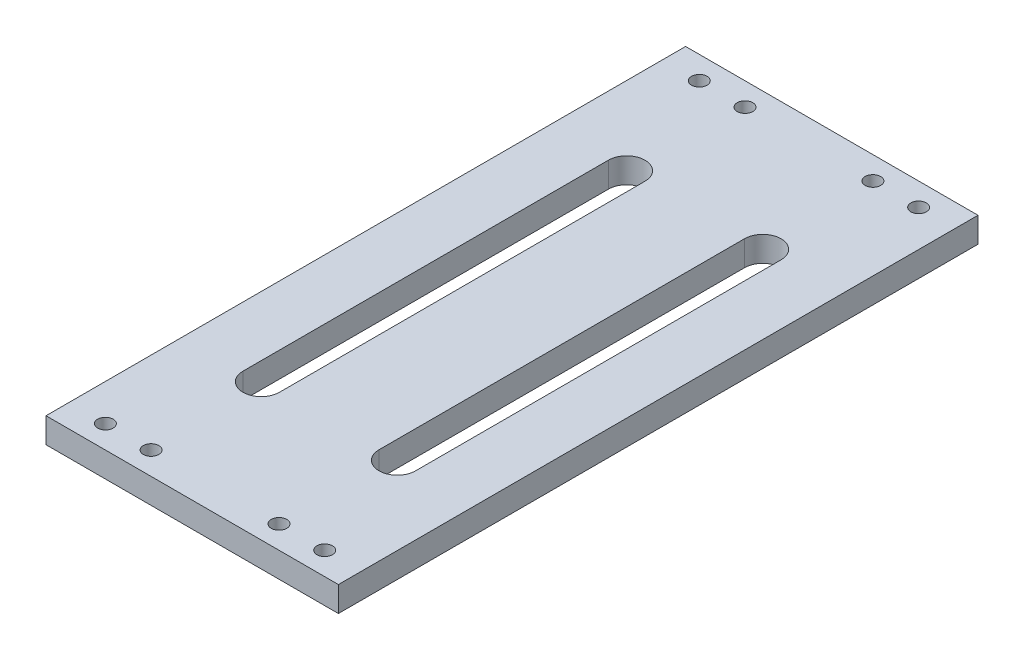
ISO-10303-21;
HEADER;
FILE_DESCRIPTION(('STEP AP214'),'2;1');
FILE_NAME('part.step','',(''),(''),'','','');
FILE_SCHEMA(('AUTOMOTIVE_DESIGN { 1 0 10303 214 1 1 1 1 }'));
ENDSEC;
DATA;
#1=APPLICATION_CONTEXT('core data for automotive mechanical design processes');
#2=APPLICATION_PROTOCOL_DEFINITION('international standard','automotive_design',2000,#1);
#3=PRODUCT_CONTEXT('',#1,'mechanical');
#4=PRODUCT('Part','Part','',(#3));
#5=PRODUCT_RELATED_PRODUCT_CATEGORY('part','',(#4));
#6=PRODUCT_DEFINITION_FORMATION('','',#4);
#7=PRODUCT_DEFINITION_CONTEXT('part definition',#1,'design');
#8=PRODUCT_DEFINITION('design','',#6,#7);
#9=PRODUCT_DEFINITION_SHAPE('','',#8);
#10=(LENGTH_UNIT() NAMED_UNIT(*) SI_UNIT(.MILLI.,.METRE.));
#11=(NAMED_UNIT(*) PLANE_ANGLE_UNIT() SI_UNIT($,.RADIAN.));
#12=(NAMED_UNIT(*) SI_UNIT($,.STERADIAN.) SOLID_ANGLE_UNIT());
#13=UNCERTAINTY_MEASURE_WITH_UNIT(LENGTH_MEASURE(1.E-05),#10,'distance_accuracy_value','');
#14=(GEOMETRIC_REPRESENTATION_CONTEXT(3) GLOBAL_UNCERTAINTY_ASSIGNED_CONTEXT((#13)) GLOBAL_UNIT_ASSIGNED_CONTEXT((#10,
#11,#12)) REPRESENTATION_CONTEXT('',''));
#15=CARTESIAN_POINT('',(0.,0.,0.));
#16=DIRECTION('',(0.,0.,1.));
#17=DIRECTION('',(1.,0.,0.));
#18=AXIS2_PLACEMENT_3D('',#15,#16,#17);
#19=CARTESIAN_POINT('',(32.,2.75,70.));
#20=DIRECTION('',(-1.,0.,0.));
#21=DIRECTION('',(0.,0.,1.));
#22=AXIS2_PLACEMENT_3D('',#19,#20,#21);
#23=PLANE('',#22);
#24=DIRECTION('',(0.,0.,-1.));
#25=VECTOR('',#24,1.);
#26=CARTESIAN_POINT('',(32.,-2.75,70.));
#27=LINE('',#26,#25);
#28=CARTESIAN_POINT('',(32.,-2.75,70.));
#29=VERTEX_POINT('',#28);
#30=CARTESIAN_POINT('',(32.,-2.75,-70.));
#31=VERTEX_POINT('',#30);
#32=EDGE_CURVE('E247',#29,#31,#27,.T.);
#33=ORIENTED_EDGE('',*,*,#32,.T.);
#34=DIRECTION('',(0.,-1.,0.));
#35=VECTOR('',#34,1.);
#36=CARTESIAN_POINT('',(32.,2.75,-70.));
#37=LINE('',#36,#35);
#38=CARTESIAN_POINT('',(32.,2.75,-70.));
#39=VERTEX_POINT('',#38);
#40=EDGE_CURVE('E271',#39,#31,#37,.T.);
#41=ORIENTED_EDGE('',*,*,#40,.F.);
#42=DIRECTION('',(0.,0.,-1.));
#43=VECTOR('',#42,1.);
#44=CARTESIAN_POINT('',(32.,2.75,70.));
#45=LINE('',#44,#43);
#46=CARTESIAN_POINT('',(32.,2.75,70.));
#47=VERTEX_POINT('',#46);
#48=EDGE_CURVE('E232',#47,#39,#45,.T.);
#49=ORIENTED_EDGE('',*,*,#48,.F.);
#50=DIRECTION('',(0.,-1.,0.));
#51=VECTOR('',#50,1.);
#52=CARTESIAN_POINT('',(32.,2.75,70.));
#53=LINE('',#52,#51);
#54=EDGE_CURVE('E246',#47,#29,#53,.T.);
#55=ORIENTED_EDGE('',*,*,#54,.T.);
#56=EDGE_LOOP('',(#33,#41,#49,#55));
#57=FACE_BOUND('',#56,.T.);
#58=ADVANCED_FACE('F45',(#57),#23,.F.);
#59=CARTESIAN_POINT('',(-32.,2.75,-70.));
#60=DIRECTION('',(0.,0.,1.));
#61=DIRECTION('',(1.,0.,0.));
#62=AXIS2_PLACEMENT_3D('',#59,#60,#61);
#63=PLANE('',#62);
#64=DIRECTION('',(-1.,0.,0.));
#65=VECTOR('',#64,1.);
#66=CARTESIAN_POINT('',(-32.,-2.75,-70.));
#67=LINE('',#66,#65);
#68=CARTESIAN_POINT('',(-32.,-2.75,-70.));
#69=VERTEX_POINT('',#68);
#70=EDGE_CURVE('E251',#31,#69,#67,.T.);
#71=ORIENTED_EDGE('',*,*,#70,.T.);
#72=DIRECTION('',(0.,-1.,0.));
#73=VECTOR('',#72,1.);
#74=CARTESIAN_POINT('',(-32.,2.75,-70.));
#75=LINE('',#74,#73);
#76=CARTESIAN_POINT('',(-32.,2.75,-70.));
#77=VERTEX_POINT('',#76);
#78=EDGE_CURVE('E267',#77,#69,#75,.T.);
#79=ORIENTED_EDGE('',*,*,#78,.F.);
#80=DIRECTION('',(-1.,0.,0.));
#81=VECTOR('',#80,1.);
#82=CARTESIAN_POINT('',(-32.,2.75,-70.));
#83=LINE('',#82,#81);
#84=EDGE_CURVE('E236',#39,#77,#83,.T.);
#85=ORIENTED_EDGE('',*,*,#84,.F.);
#86=ORIENTED_EDGE('',*,*,#40,.T.);
#87=EDGE_LOOP('',(#71,#79,#85,#86));
#88=FACE_BOUND('',#87,.T.);
#89=ADVANCED_FACE('F347',(#88),#63,.F.);
#90=CARTESIAN_POINT('',(-32.,2.75,70.));
#91=DIRECTION('',(1.,0.,0.));
#92=DIRECTION('',(0.,0.,-1.));
#93=AXIS2_PLACEMENT_3D('',#90,#91,#92);
#94=PLANE('',#93);
#95=DIRECTION('',(0.,0.,1.));
#96=VECTOR('',#95,1.);
#97=CARTESIAN_POINT('',(-32.,-2.75,70.));
#98=LINE('',#97,#96);
#99=CARTESIAN_POINT('',(-32.,-2.75,70.));
#100=VERTEX_POINT('',#99);
#101=EDGE_CURVE('E255',#69,#100,#98,.T.);
#102=ORIENTED_EDGE('',*,*,#101,.T.);
#103=DIRECTION('',(0.,-1.,0.));
#104=VECTOR('',#103,1.);
#105=CARTESIAN_POINT('',(-32.,2.75,70.));
#106=LINE('',#105,#104);
#107=CARTESIAN_POINT('',(-32.,2.75,70.));
#108=VERTEX_POINT('',#107);
#109=EDGE_CURVE('E263',#108,#100,#106,.T.);
#110=ORIENTED_EDGE('',*,*,#109,.F.);
#111=DIRECTION('',(0.,0.,1.));
#112=VECTOR('',#111,1.);
#113=CARTESIAN_POINT('',(-32.,2.75,70.));
#114=LINE('',#113,#112);
#115=EDGE_CURVE('E240',#77,#108,#114,.T.);
#116=ORIENTED_EDGE('',*,*,#115,.F.);
#117=ORIENTED_EDGE('',*,*,#78,.T.);
#118=EDGE_LOOP('',(#102,#110,#116,#117));
#119=FACE_BOUND('',#118,.T.);
#120=ADVANCED_FACE('F352',(#119),#94,.F.);
#121=CARTESIAN_POINT('',(-32.,2.75,70.));
#122=DIRECTION('',(0.,0.,-1.));
#123=DIRECTION('',(-1.,0.,0.));
#124=AXIS2_PLACEMENT_3D('',#121,#122,#123);
#125=PLANE('',#124);
#126=DIRECTION('',(1.,0.,0.));
#127=VECTOR('',#126,1.);
#128=CARTESIAN_POINT('',(-32.,-2.75,70.));
#129=LINE('',#128,#127);
#130=EDGE_CURVE('E237',#100,#29,#129,.T.);
#131=ORIENTED_EDGE('',*,*,#130,.T.);
#132=ORIENTED_EDGE('',*,*,#54,.F.);
#133=DIRECTION('',(1.,0.,0.));
#134=VECTOR('',#133,1.);
#135=CARTESIAN_POINT('',(-32.,2.75,70.));
#136=LINE('',#135,#134);
#137=EDGE_CURVE('E243',#108,#47,#136,.T.);
#138=ORIENTED_EDGE('',*,*,#137,.F.);
#139=ORIENTED_EDGE('',*,*,#109,.T.);
#140=EDGE_LOOP('',(#131,#132,#138,#139));
#141=FACE_BOUND('',#140,.T.);
#142=ADVANCED_FACE('F367',(#141),#125,.F.);
#143=CARTESIAN_POINT('',(0.,2.75,0.));
#144=DIRECTION('',(0.,-1.,0.));
#145=DIRECTION('',(0.,0.,-1.));
#146=AXIS2_PLACEMENT_3D('',#143,#144,#145);
#147=PLANE('',#146);
#148=DIRECTION('',(0.,0.,1.));
#149=VECTOR('',#148,1.);
#150=CARTESIAN_POINT('',(-18.8933895129075,2.75,-40.));
#151=LINE('',#150,#149);
#152=CARTESIAN_POINT('',(-18.8933895129075,2.75,-40.));
#153=VERTEX_POINT('',#152);
#154=CARTESIAN_POINT('',(-18.8933895129075,2.75,40.));
#155=VERTEX_POINT('',#154);
#156=EDGE_CURVE('E151',#153,#155,#151,.T.);
#157=ORIENTED_EDGE('',*,*,#156,.F.);
#158=CARTESIAN_POINT('',(-14.8933895129075,2.75,-40.));
#159=DIRECTION('',(0.,1.,0.));
#160=DIRECTION('',(0.,0.,1.));
#161=AXIS2_PLACEMENT_3D('',#158,#159,#160);
#162=CIRCLE('',#161,4.);
#163=CARTESIAN_POINT('',(-10.8933895129076,2.75,-40.));
#164=VERTEX_POINT('',#163);
#165=EDGE_CURVE('E60',#164,#153,#162,.T.);
#166=ORIENTED_EDGE('',*,*,#165,.F.);
#167=DIRECTION('',(0.,0.,-1.));
#168=VECTOR('',#167,1.);
#169=CARTESIAN_POINT('',(-10.8933895129076,2.75,-40.));
#170=LINE('',#169,#168);
#171=CARTESIAN_POINT('',(-10.8933895129075,2.75,40.));
#172=VERTEX_POINT('',#171);
#173=EDGE_CURVE('E159',#172,#164,#170,.T.);
#174=ORIENTED_EDGE('',*,*,#173,.F.);
#175=CARTESIAN_POINT('',(-14.8933895129075,2.75,40.));
#176=DIRECTION('',(0.,1.,0.));
#177=DIRECTION('',(0.,0.,1.));
#178=AXIS2_PLACEMENT_3D('',#175,#176,#177);
#179=CIRCLE('',#178,4.);
#180=EDGE_CURVE('E140',#155,#172,#179,.T.);
#181=ORIENTED_EDGE('',*,*,#180,.F.);
#182=EDGE_LOOP('',(#157,#166,#174,#181));
#183=FACE_BOUND('',#182,.T.);
#184=DIRECTION('',(0.,0.,1.));
#185=VECTOR('',#184,1.);
#186=CARTESIAN_POINT('',(10.8933895129076,2.75,-40.));
#187=LINE('',#186,#185);
#188=CARTESIAN_POINT('',(10.8933895129076,2.75,-40.));
#189=VERTEX_POINT('',#188);
#190=CARTESIAN_POINT('',(10.8933895129075,2.75,40.));
#191=VERTEX_POINT('',#190);
#192=EDGE_CURVE('E194',#189,#191,#187,.T.);
#193=ORIENTED_EDGE('',*,*,#192,.F.);
#194=CARTESIAN_POINT('',(14.8933895129075,2.75,-40.));
#195=DIRECTION('',(0.,1.,0.));
#196=DIRECTION('',(0.,0.,-1.));
#197=AXIS2_PLACEMENT_3D('',#194,#195,#196);
#198=CIRCLE('',#197,4.);
#199=CARTESIAN_POINT('',(18.8933895129075,2.75,-40.));
#200=VERTEX_POINT('',#199);
#201=EDGE_CURVE('E68',#200,#189,#198,.T.);
#202=ORIENTED_EDGE('',*,*,#201,.F.);
#203=DIRECTION('',(0.,0.,-1.));
#204=VECTOR('',#203,1.);
#205=CARTESIAN_POINT('',(18.8933895129075,2.75,-40.));
#206=LINE('',#205,#204);
#207=CARTESIAN_POINT('',(18.8933895129075,2.75,40.));
#208=VERTEX_POINT('',#207);
#209=EDGE_CURVE('E177',#208,#200,#206,.T.);
#210=ORIENTED_EDGE('',*,*,#209,.F.);
#211=CARTESIAN_POINT('',(14.8933895129075,2.75,40.));
#212=DIRECTION('',(0.,1.,0.));
#213=DIRECTION('',(0.,0.,-1.));
#214=AXIS2_PLACEMENT_3D('',#211,#212,#213);
#215=CIRCLE('',#214,4.);
#216=EDGE_CURVE('E190',#191,#208,#215,.T.);
#217=ORIENTED_EDGE('',*,*,#216,.F.);
#218=EDGE_LOOP('',(#193,#202,#210,#217));
#219=FACE_BOUND('',#218,.T.);
#220=CARTESIAN_POINT('',(-24.,2.75,65.));
#221=DIRECTION('',(0.,1.,0.));
#222=DIRECTION('',(0.,0.,-1.));
#223=AXIS2_PLACEMENT_3D('',#220,#221,#222);
#224=CIRCLE('',#223,1.7);
#225=CARTESIAN_POINT('',(-24.,2.75,63.3));
#226=VERTEX_POINT('',#225);
#227=EDGE_CURVE('E212',#226,#226,#224,.T.);
#228=ORIENTED_EDGE('',*,*,#227,.F.);
#229=EDGE_LOOP('',(#228));
#230=FACE_BOUND('',#229,.T.);
#231=CARTESIAN_POINT('',(24.,2.75,65.));
#232=DIRECTION('',(0.,1.,0.));
#233=DIRECTION('',(0.,0.,1.));
#234=AXIS2_PLACEMENT_3D('',#231,#232,#233);
#235=CIRCLE('',#234,1.7);
#236=CARTESIAN_POINT('',(24.,2.75,66.7));
#237=VERTEX_POINT('',#236);
#238=EDGE_CURVE('E217',#237,#237,#235,.T.);
#239=ORIENTED_EDGE('',*,*,#238,.F.);
#240=EDGE_LOOP('',(#239));
#241=FACE_BOUND('',#240,.T.);
#242=CARTESIAN_POINT('',(24.,2.75,-65.));
#243=DIRECTION('',(0.,1.,0.));
#244=DIRECTION('',(0.,0.,-1.));
#245=AXIS2_PLACEMENT_3D('',#242,#243,#244);
#246=CIRCLE('',#245,1.7);
#247=CARTESIAN_POINT('',(24.,2.75,-66.7));
#248=VERTEX_POINT('',#247);
#249=EDGE_CURVE('E221',#248,#248,#246,.T.);
#250=ORIENTED_EDGE('',*,*,#249,.F.);
#251=EDGE_LOOP('',(#250));
#252=FACE_BOUND('',#251,.T.);
#253=CARTESIAN_POINT('',(-14.,2.75,-65.));
#254=DIRECTION('',(0.,1.,0.));
#255=DIRECTION('',(0.,0.,1.));
#256=AXIS2_PLACEMENT_3D('',#253,#254,#255);
#257=CIRCLE('',#256,1.7);
#258=CARTESIAN_POINT('',(-14.,2.75,-63.3));
#259=VERTEX_POINT('',#258);
#260=EDGE_CURVE('E204',#259,#259,#257,.T.);
#261=ORIENTED_EDGE('',*,*,#260,.F.);
#262=EDGE_LOOP('',(#261));
#263=FACE_BOUND('',#262,.T.);
#264=CARTESIAN_POINT('',(-14.,2.75,65.));
#265=DIRECTION('',(0.,1.,0.));
#266=DIRECTION('',(0.,0.,-1.));
#267=AXIS2_PLACEMENT_3D('',#264,#265,#266);
#268=CIRCLE('',#267,1.7);
#269=CARTESIAN_POINT('',(-14.,2.75,63.3));
#270=VERTEX_POINT('',#269);
#271=EDGE_CURVE('E200',#270,#270,#268,.T.);
#272=ORIENTED_EDGE('',*,*,#271,.F.);
#273=EDGE_LOOP('',(#272));
#274=FACE_BOUND('',#273,.T.);
#275=CARTESIAN_POINT('',(14.,2.75,65.));
#276=DIRECTION('',(0.,1.,0.));
#277=DIRECTION('',(0.,0.,1.));
#278=AXIS2_PLACEMENT_3D('',#275,#276,#277);
#279=CIRCLE('',#278,1.7);
#280=CARTESIAN_POINT('',(14.,2.75,66.7));
#281=VERTEX_POINT('',#280);
#282=EDGE_CURVE('E205',#281,#281,#279,.T.);
#283=ORIENTED_EDGE('',*,*,#282,.F.);
#284=EDGE_LOOP('',(#283));
#285=FACE_BOUND('',#284,.T.);
#286=CARTESIAN_POINT('',(14.,2.75,-65.));
#287=DIRECTION('',(0.,1.,0.));
#288=DIRECTION('',(0.,0.,-1.));
#289=AXIS2_PLACEMENT_3D('',#286,#287,#288);
#290=CIRCLE('',#289,1.7);
#291=CARTESIAN_POINT('',(14.,2.75,-66.7));
#292=VERTEX_POINT('',#291);
#293=EDGE_CURVE('E169',#292,#292,#290,.T.);
#294=ORIENTED_EDGE('',*,*,#293,.F.);
#295=EDGE_LOOP('',(#294));
#296=FACE_BOUND('',#295,.T.);
#297=CARTESIAN_POINT('',(-24.,2.75,-65.));
#298=DIRECTION('',(0.,1.,0.));
#299=DIRECTION('',(0.,0.,1.));
#300=AXIS2_PLACEMENT_3D('',#297,#298,#299);
#301=CIRCLE('',#300,1.7);
#302=CARTESIAN_POINT('',(-24.,2.75,-63.3));
#303=VERTEX_POINT('',#302);
#304=EDGE_CURVE('E216',#303,#303,#301,.T.);
#305=ORIENTED_EDGE('',*,*,#304,.F.);
#306=EDGE_LOOP('',(#305));
#307=FACE_BOUND('',#306,.T.);
#308=ORIENTED_EDGE('',*,*,#48,.T.);
#309=ORIENTED_EDGE('',*,*,#84,.T.);
#310=ORIENTED_EDGE('',*,*,#115,.T.);
#311=ORIENTED_EDGE('',*,*,#137,.T.);
#312=EDGE_LOOP('',(#308,#309,#310,#311));
#313=FACE_BOUND('',#312,.T.);
#314=ADVANCED_FACE('F156',(#183,#219,#230,#241,#252,#263,#274,#285,#296,#307,#313),#147,.F.);
#315=CARTESIAN_POINT('',(0.,-2.75,0.));
#316=DIRECTION('',(0.,-1.,0.));
#317=DIRECTION('',(0.,0.,-1.));
#318=AXIS2_PLACEMENT_3D('',#315,#316,#317);
#319=PLANE('',#318);
#320=CARTESIAN_POINT('',(-14.8933895129075,-2.75,-40.));
#321=DIRECTION('',(0.,-1.,0.));
#322=DIRECTION('',(0.,0.,-1.));
#323=AXIS2_PLACEMENT_3D('',#320,#321,#322);
#324=CIRCLE('',#323,4.);
#325=CARTESIAN_POINT('',(-18.8933895129075,-2.75,-40.));
#326=VERTEX_POINT('',#325);
#327=CARTESIAN_POINT('',(-10.8933895129076,-2.75,-40.));
#328=VERTEX_POINT('',#327);
#329=EDGE_CURVE('E11',#326,#328,#324,.T.);
#330=ORIENTED_EDGE('',*,*,#329,.F.);
#331=DIRECTION('',(0.,0.,-1.));
#332=VECTOR('',#331,1.);
#333=CARTESIAN_POINT('',(-18.8933895129075,-2.75,0.));
#334=LINE('',#333,#332);
#335=CARTESIAN_POINT('',(-18.8933895129075,-2.75,40.));
#336=VERTEX_POINT('',#335);
#337=EDGE_CURVE('E318',#336,#326,#334,.T.);
#338=ORIENTED_EDGE('',*,*,#337,.F.);
#339=CARTESIAN_POINT('',(-14.8933895129075,-2.75,40.));
#340=DIRECTION('',(0.,-1.,0.));
#341=DIRECTION('',(0.,0.,-1.));
#342=AXIS2_PLACEMENT_3D('',#339,#340,#341);
#343=CIRCLE('',#342,4.);
#344=CARTESIAN_POINT('',(-10.8933895129075,-2.75,40.));
#345=VERTEX_POINT('',#344);
#346=EDGE_CURVE('E143',#345,#336,#343,.T.);
#347=ORIENTED_EDGE('',*,*,#346,.F.);
#348=DIRECTION('',(0.,0.,1.));
#349=VECTOR('',#348,1.);
#350=CARTESIAN_POINT('',(-10.8933895129075,-2.75,0.));
#351=LINE('',#350,#349);
#352=EDGE_CURVE('E53',#328,#345,#351,.T.);
#353=ORIENTED_EDGE('',*,*,#352,.F.);
#354=EDGE_LOOP('',(#330,#338,#347,#353));
#355=FACE_BOUND('',#354,.T.);
#356=CARTESIAN_POINT('',(14.8933895129075,-2.75,-40.));
#357=DIRECTION('',(0.,-1.,0.));
#358=DIRECTION('',(0.,0.,-1.));
#359=AXIS2_PLACEMENT_3D('',#356,#357,#358);
#360=CIRCLE('',#359,4.);
#361=CARTESIAN_POINT('',(10.8933895129076,-2.75,-40.));
#362=VERTEX_POINT('',#361);
#363=CARTESIAN_POINT('',(18.8933895129075,-2.75,-40.));
#364=VERTEX_POINT('',#363);
#365=EDGE_CURVE('E315',#362,#364,#360,.T.);
#366=ORIENTED_EDGE('',*,*,#365,.F.);
#367=DIRECTION('',(0.,0.,-1.));
#368=VECTOR('',#367,1.);
#369=CARTESIAN_POINT('',(10.8933895129075,-2.75,0.));
#370=LINE('',#369,#368);
#371=CARTESIAN_POINT('',(10.8933895129075,-2.75,40.));
#372=VERTEX_POINT('',#371);
#373=EDGE_CURVE('E275',#372,#362,#370,.T.);
#374=ORIENTED_EDGE('',*,*,#373,.F.);
#375=CARTESIAN_POINT('',(14.8933895129075,-2.75,40.));
#376=DIRECTION('',(0.,-1.,0.));
#377=DIRECTION('',(0.,0.,-1.));
#378=AXIS2_PLACEMENT_3D('',#375,#376,#377);
#379=CIRCLE('',#378,4.);
#380=CARTESIAN_POINT('',(18.8933895129075,-2.75,40.));
#381=VERTEX_POINT('',#380);
#382=EDGE_CURVE('E308',#381,#372,#379,.T.);
#383=ORIENTED_EDGE('',*,*,#382,.F.);
#384=DIRECTION('',(0.,0.,1.));
#385=VECTOR('',#384,1.);
#386=CARTESIAN_POINT('',(18.8933895129075,-2.75,0.));
#387=LINE('',#386,#385);
#388=EDGE_CURVE('E312',#364,#381,#387,.T.);
#389=ORIENTED_EDGE('',*,*,#388,.F.);
#390=EDGE_LOOP('',(#366,#374,#383,#389));
#391=FACE_BOUND('',#390,.T.);
#392=CARTESIAN_POINT('',(-24.,-2.75,65.));
#393=DIRECTION('',(0.,-1.,0.));
#394=DIRECTION('',(0.,0.,-1.));
#395=AXIS2_PLACEMENT_3D('',#392,#393,#394);
#396=CIRCLE('',#395,1.7);
#397=CARTESIAN_POINT('',(-24.,-2.75,63.3));
#398=VERTEX_POINT('',#397);
#399=EDGE_CURVE('E252',#398,#398,#396,.T.);
#400=ORIENTED_EDGE('',*,*,#399,.F.);
#401=EDGE_LOOP('',(#400));
#402=FACE_BOUND('',#401,.T.);
#403=CARTESIAN_POINT('',(24.,-2.75,65.));
#404=DIRECTION('',(0.,-1.,0.));
#405=DIRECTION('',(0.,0.,-1.));
#406=AXIS2_PLACEMENT_3D('',#403,#404,#405);
#407=CIRCLE('',#406,1.7);
#408=CARTESIAN_POINT('',(24.,-2.75,63.3));
#409=VERTEX_POINT('',#408);
#410=EDGE_CURVE('E299',#409,#409,#407,.T.);
#411=ORIENTED_EDGE('',*,*,#410,.F.);
#412=EDGE_LOOP('',(#411));
#413=FACE_BOUND('',#412,.T.);
#414=CARTESIAN_POINT('',(24.,-2.75,-65.));
#415=DIRECTION('',(0.,-1.,0.));
#416=DIRECTION('',(0.,0.,-1.));
#417=AXIS2_PLACEMENT_3D('',#414,#415,#416);
#418=CIRCLE('',#417,1.7);
#419=CARTESIAN_POINT('',(24.,-2.75,-66.7));
#420=VERTEX_POINT('',#419);
#421=EDGE_CURVE('E295',#420,#420,#418,.T.);
#422=ORIENTED_EDGE('',*,*,#421,.F.);
#423=EDGE_LOOP('',(#422));
#424=FACE_BOUND('',#423,.T.);
#425=CARTESIAN_POINT('',(-14.,-2.75,-65.));
#426=DIRECTION('',(0.,-1.,0.));
#427=DIRECTION('',(0.,0.,-1.));
#428=AXIS2_PLACEMENT_3D('',#425,#426,#427);
#429=CIRCLE('',#428,1.7);
#430=CARTESIAN_POINT('',(-14.,-2.75,-66.7));
#431=VERTEX_POINT('',#430);
#432=EDGE_CURVE('E291',#431,#431,#429,.T.);
#433=ORIENTED_EDGE('',*,*,#432,.F.);
#434=EDGE_LOOP('',(#433));
#435=FACE_BOUND('',#434,.T.);
#436=CARTESIAN_POINT('',(-14.,-2.75,65.));
#437=DIRECTION('',(0.,-1.,0.));
#438=DIRECTION('',(0.,0.,-1.));
#439=AXIS2_PLACEMENT_3D('',#436,#437,#438);
#440=CIRCLE('',#439,1.7);
#441=CARTESIAN_POINT('',(-14.,-2.75,63.3));
#442=VERTEX_POINT('',#441);
#443=EDGE_CURVE('E287',#442,#442,#440,.T.);
#444=ORIENTED_EDGE('',*,*,#443,.F.);
#445=EDGE_LOOP('',(#444));
#446=FACE_BOUND('',#445,.T.);
#447=CARTESIAN_POINT('',(14.,-2.75,65.));
#448=DIRECTION('',(0.,-1.,0.));
#449=DIRECTION('',(0.,0.,-1.));
#450=AXIS2_PLACEMENT_3D('',#447,#448,#449);
#451=CIRCLE('',#450,1.7);
#452=CARTESIAN_POINT('',(14.,-2.75,63.3));
#453=VERTEX_POINT('',#452);
#454=EDGE_CURVE('E283',#453,#453,#451,.T.);
#455=ORIENTED_EDGE('',*,*,#454,.F.);
#456=EDGE_LOOP('',(#455));
#457=FACE_BOUND('',#456,.T.);
#458=CARTESIAN_POINT('',(14.,-2.75,-65.));
#459=DIRECTION('',(0.,-1.,0.));
#460=DIRECTION('',(0.,0.,-1.));
#461=AXIS2_PLACEMENT_3D('',#458,#459,#460);
#462=CIRCLE('',#461,1.7);
#463=CARTESIAN_POINT('',(14.,-2.75,-66.7));
#464=VERTEX_POINT('',#463);
#465=EDGE_CURVE('E279',#464,#464,#462,.T.);
#466=ORIENTED_EDGE('',*,*,#465,.F.);
#467=EDGE_LOOP('',(#466));
#468=FACE_BOUND('',#467,.T.);
#469=CARTESIAN_POINT('',(-24.,-2.75,-65.));
#470=DIRECTION('',(0.,-1.,0.));
#471=DIRECTION('',(0.,0.,-1.));
#472=AXIS2_PLACEMENT_3D('',#469,#470,#471);
#473=CIRCLE('',#472,1.7);
#474=CARTESIAN_POINT('',(-24.,-2.75,-66.7));
#475=VERTEX_POINT('',#474);
#476=EDGE_CURVE('E231',#475,#475,#473,.T.);
#477=ORIENTED_EDGE('',*,*,#476,.F.);
#478=EDGE_LOOP('',(#477));
#479=FACE_BOUND('',#478,.T.);
#480=ORIENTED_EDGE('',*,*,#32,.F.);
#481=ORIENTED_EDGE('',*,*,#130,.F.);
#482=ORIENTED_EDGE('',*,*,#101,.F.);
#483=ORIENTED_EDGE('',*,*,#70,.F.);
#484=EDGE_LOOP('',(#480,#481,#482,#483));
#485=FACE_BOUND('',#484,.T.);
#486=ADVANCED_FACE('F329',(#355,#391,#402,#413,#424,#435,#446,#457,#468,#479,#485),#319,.T.);
#487=CARTESIAN_POINT('',(-24.,-5.25,-65.));
#488=DIRECTION('',(0.,1.,0.));
#489=DIRECTION('',(0.,0.,1.));
#490=AXIS2_PLACEMENT_3D('',#487,#488,#489);
#491=CYLINDRICAL_SURFACE('',#490,1.7);
#492=ORIENTED_EDGE('',*,*,#476,.T.);
#493=EDGE_LOOP('',(#492));
#494=FACE_BOUND('',#493,.T.);
#495=ORIENTED_EDGE('',*,*,#304,.T.);
#496=EDGE_LOOP('',(#495));
#497=FACE_BOUND('',#496,.T.);
#498=ADVANCED_FACE('F378',(#494,#497),#491,.F.);
#499=CARTESIAN_POINT('',(14.,-5.25,-65.));
#500=DIRECTION('',(0.,1.,0.));
#501=DIRECTION('',(0.,0.,1.));
#502=AXIS2_PLACEMENT_3D('',#499,#500,#501);
#503=CYLINDRICAL_SURFACE('',#502,1.7);
#504=ORIENTED_EDGE('',*,*,#465,.T.);
#505=EDGE_LOOP('',(#504));
#506=FACE_BOUND('',#505,.T.);
#507=ORIENTED_EDGE('',*,*,#293,.T.);
#508=EDGE_LOOP('',(#507));
#509=FACE_BOUND('',#508,.T.);
#510=ADVANCED_FACE('F383',(#506,#509),#503,.F.);
#511=CARTESIAN_POINT('',(14.,-5.25,65.));
#512=DIRECTION('',(0.,1.,0.));
#513=DIRECTION('',(0.,0.,1.));
#514=AXIS2_PLACEMENT_3D('',#511,#512,#513);
#515=CYLINDRICAL_SURFACE('',#514,1.7);
#516=ORIENTED_EDGE('',*,*,#454,.T.);
#517=EDGE_LOOP('',(#516));
#518=FACE_BOUND('',#517,.T.);
#519=ORIENTED_EDGE('',*,*,#282,.T.);
#520=EDGE_LOOP('',(#519));
#521=FACE_BOUND('',#520,.T.);
#522=ADVANCED_FACE('F405',(#518,#521),#515,.F.);
#523=CARTESIAN_POINT('',(-14.,-5.25,65.));
#524=DIRECTION('',(0.,1.,0.));
#525=DIRECTION('',(0.,0.,1.));
#526=AXIS2_PLACEMENT_3D('',#523,#524,#525);
#527=CYLINDRICAL_SURFACE('',#526,1.7);
#528=ORIENTED_EDGE('',*,*,#443,.T.);
#529=EDGE_LOOP('',(#528));
#530=FACE_BOUND('',#529,.T.);
#531=ORIENTED_EDGE('',*,*,#271,.T.);
#532=EDGE_LOOP('',(#531));
#533=FACE_BOUND('',#532,.T.);
#534=ADVANCED_FACE('F389',(#530,#533),#527,.F.);
#535=CARTESIAN_POINT('',(-14.,-5.25,-65.));
#536=DIRECTION('',(0.,1.,0.));
#537=DIRECTION('',(0.,0.,1.));
#538=AXIS2_PLACEMENT_3D('',#535,#536,#537);
#539=CYLINDRICAL_SURFACE('',#538,1.7);
#540=ORIENTED_EDGE('',*,*,#432,.T.);
#541=EDGE_LOOP('',(#540));
#542=FACE_BOUND('',#541,.T.);
#543=ORIENTED_EDGE('',*,*,#260,.T.);
#544=EDGE_LOOP('',(#543));
#545=FACE_BOUND('',#544,.T.);
#546=ADVANCED_FACE('F385',(#542,#545),#539,.F.);
#547=CARTESIAN_POINT('',(24.,-5.25,-65.));
#548=DIRECTION('',(0.,1.,0.));
#549=DIRECTION('',(0.,0.,1.));
#550=AXIS2_PLACEMENT_3D('',#547,#548,#549);
#551=CYLINDRICAL_SURFACE('',#550,1.7);
#552=ORIENTED_EDGE('',*,*,#421,.T.);
#553=EDGE_LOOP('',(#552));
#554=FACE_BOUND('',#553,.T.);
#555=ORIENTED_EDGE('',*,*,#249,.T.);
#556=EDGE_LOOP('',(#555));
#557=FACE_BOUND('',#556,.T.);
#558=ADVANCED_FACE('F388',(#554,#557),#551,.F.);
#559=CARTESIAN_POINT('',(24.,-5.25,65.));
#560=DIRECTION('',(0.,1.,0.));
#561=DIRECTION('',(0.,0.,1.));
#562=AXIS2_PLACEMENT_3D('',#559,#560,#561);
#563=CYLINDRICAL_SURFACE('',#562,1.7);
#564=ORIENTED_EDGE('',*,*,#410,.T.);
#565=EDGE_LOOP('',(#564));
#566=FACE_BOUND('',#565,.T.);
#567=ORIENTED_EDGE('',*,*,#238,.T.);
#568=EDGE_LOOP('',(#567));
#569=FACE_BOUND('',#568,.T.);
#570=ADVANCED_FACE('F393',(#566,#569),#563,.F.);
#571=CARTESIAN_POINT('',(-24.,-5.25,65.));
#572=DIRECTION('',(0.,1.,0.));
#573=DIRECTION('',(0.,0.,1.));
#574=AXIS2_PLACEMENT_3D('',#571,#572,#573);
#575=CYLINDRICAL_SURFACE('',#574,1.7);
#576=ORIENTED_EDGE('',*,*,#399,.T.);
#577=EDGE_LOOP('',(#576));
#578=FACE_BOUND('',#577,.T.);
#579=ORIENTED_EDGE('',*,*,#227,.T.);
#580=EDGE_LOOP('',(#579));
#581=FACE_BOUND('',#580,.T.);
#582=ADVANCED_FACE('F397',(#578,#581),#575,.F.);
#583=CARTESIAN_POINT('',(14.8933895129075,-7.25,-40.));
#584=DIRECTION('',(0.,1.,0.));
#585=DIRECTION('',(0.,0.,1.));
#586=AXIS2_PLACEMENT_3D('',#583,#584,#585);
#587=CYLINDRICAL_SURFACE('',#586,4.);
#588=ORIENTED_EDGE('',*,*,#365,.T.);
#589=DIRECTION('',(0.,1.,0.));
#590=VECTOR('',#589,1.);
#591=CARTESIAN_POINT('',(18.8933895129075,-7.25,-40.));
#592=LINE('',#591,#590);
#593=EDGE_CURVE('E184',#364,#200,#592,.T.);
#594=ORIENTED_EDGE('',*,*,#593,.T.);
#595=ORIENTED_EDGE('',*,*,#201,.T.);
#596=DIRECTION('',(0.,1.,0.));
#597=VECTOR('',#596,1.);
#598=CARTESIAN_POINT('',(10.8933895129076,-7.25,-40.));
#599=LINE('',#598,#597);
#600=EDGE_CURVE('E174',#362,#189,#599,.T.);
#601=ORIENTED_EDGE('',*,*,#600,.F.);
#602=EDGE_LOOP('',(#588,#594,#595,#601));
#603=FACE_BOUND('',#602,.T.);
#604=ADVANCED_FACE('F401',(#603),#587,.F.);
#605=CARTESIAN_POINT('',(18.8933895129075,-7.25,-40.));
#606=DIRECTION('',(1.,0.,0.));
#607=DIRECTION('',(0.,0.,-1.));
#608=AXIS2_PLACEMENT_3D('',#605,#606,#607);
#609=PLANE('',#608);
#610=ORIENTED_EDGE('',*,*,#388,.T.);
#611=DIRECTION('',(0.,1.,0.));
#612=VECTOR('',#611,1.);
#613=CARTESIAN_POINT('',(18.8933895129075,-7.25,40.));
#614=LINE('',#613,#612);
#615=EDGE_CURVE('E181',#381,#208,#614,.T.);
#616=ORIENTED_EDGE('',*,*,#615,.T.);
#617=ORIENTED_EDGE('',*,*,#209,.T.);
#618=ORIENTED_EDGE('',*,*,#593,.F.);
#619=EDGE_LOOP('',(#610,#616,#617,#618));
#620=FACE_BOUND('',#619,.T.);
#621=ADVANCED_FACE('F413',(#620),#609,.F.);
#622=CARTESIAN_POINT('',(14.8933895129075,-7.25,40.));
#623=DIRECTION('',(0.,1.,0.));
#624=DIRECTION('',(0.,0.,1.));
#625=AXIS2_PLACEMENT_3D('',#622,#623,#624);
#626=CYLINDRICAL_SURFACE('',#625,4.);
#627=ORIENTED_EDGE('',*,*,#382,.T.);
#628=DIRECTION('',(0.,1.,0.));
#629=VECTOR('',#628,1.);
#630=CARTESIAN_POINT('',(10.8933895129075,-7.25,40.));
#631=LINE('',#630,#629);
#632=EDGE_CURVE('E178',#372,#191,#631,.T.);
#633=ORIENTED_EDGE('',*,*,#632,.T.);
#634=ORIENTED_EDGE('',*,*,#216,.T.);
#635=ORIENTED_EDGE('',*,*,#615,.F.);
#636=EDGE_LOOP('',(#627,#633,#634,#635));
#637=FACE_BOUND('',#636,.T.);
#638=ADVANCED_FACE('F341',(#637),#626,.F.);
#639=CARTESIAN_POINT('',(10.8933895129076,-7.25,-40.));
#640=DIRECTION('',(-1.,0.,0.));
#641=DIRECTION('',(0.,0.,1.));
#642=AXIS2_PLACEMENT_3D('',#639,#640,#641);
#643=PLANE('',#642);
#644=ORIENTED_EDGE('',*,*,#373,.T.);
#645=ORIENTED_EDGE('',*,*,#600,.T.);
#646=ORIENTED_EDGE('',*,*,#192,.T.);
#647=ORIENTED_EDGE('',*,*,#632,.F.);
#648=EDGE_LOOP('',(#644,#645,#646,#647));
#649=FACE_BOUND('',#648,.T.);
#650=ADVANCED_FACE('F334',(#649),#643,.F.);
#651=CARTESIAN_POINT('',(-14.8933895129075,-7.25,-40.));
#652=DIRECTION('',(0.,1.,0.));
#653=DIRECTION('',(0.,0.,1.));
#654=AXIS2_PLACEMENT_3D('',#651,#652,#653);
#655=CYLINDRICAL_SURFACE('',#654,4.);
#656=ORIENTED_EDGE('',*,*,#329,.T.);
#657=DIRECTION('',(0.,1.,0.));
#658=VECTOR('',#657,1.);
#659=CARTESIAN_POINT('',(-10.8933895129076,-7.25,-40.));
#660=LINE('',#659,#658);
#661=EDGE_CURVE('E166',#328,#164,#660,.T.);
#662=ORIENTED_EDGE('',*,*,#661,.T.);
#663=ORIENTED_EDGE('',*,*,#165,.T.);
#664=DIRECTION('',(0.,1.,0.));
#665=VECTOR('',#664,1.);
#666=CARTESIAN_POINT('',(-18.8933895129075,-7.25,-40.));
#667=LINE('',#666,#665);
#668=EDGE_CURVE('E148',#326,#153,#667,.T.);
#669=ORIENTED_EDGE('',*,*,#668,.F.);
#670=EDGE_LOOP('',(#656,#662,#663,#669));
#671=FACE_BOUND('',#670,.T.);
#672=ADVANCED_FACE('F331',(#671),#655,.F.);
#673=CARTESIAN_POINT('',(-10.8933895129076,-7.25,-40.));
#674=DIRECTION('',(1.,0.,0.));
#675=DIRECTION('',(0.,0.,-1.));
#676=AXIS2_PLACEMENT_3D('',#673,#674,#675);
#677=PLANE('',#676);
#678=ORIENTED_EDGE('',*,*,#352,.T.);
#679=DIRECTION('',(0.,1.,0.));
#680=VECTOR('',#679,1.);
#681=CARTESIAN_POINT('',(-10.8933895129075,-7.25,40.));
#682=LINE('',#681,#680);
#683=EDGE_CURVE('E147',#345,#172,#682,.T.);
#684=ORIENTED_EDGE('',*,*,#683,.T.);
#685=ORIENTED_EDGE('',*,*,#173,.T.);
#686=ORIENTED_EDGE('',*,*,#661,.F.);
#687=EDGE_LOOP('',(#678,#684,#685,#686));
#688=FACE_BOUND('',#687,.T.);
#689=ADVANCED_FACE('F326',(#688),#677,.F.);
#690=CARTESIAN_POINT('',(-14.8933895129075,-7.25,40.));
#691=DIRECTION('',(0.,1.,0.));
#692=DIRECTION('',(0.,0.,1.));
#693=AXIS2_PLACEMENT_3D('',#690,#691,#692);
#694=CYLINDRICAL_SURFACE('',#693,4.);
#695=ORIENTED_EDGE('',*,*,#346,.T.);
#696=DIRECTION('',(0.,1.,0.));
#697=VECTOR('',#696,1.);
#698=CARTESIAN_POINT('',(-18.8933895129075,-7.25,40.));
#699=LINE('',#698,#697);
#700=EDGE_CURVE('E135',#336,#155,#699,.T.);
#701=ORIENTED_EDGE('',*,*,#700,.T.);
#702=ORIENTED_EDGE('',*,*,#180,.T.);
#703=ORIENTED_EDGE('',*,*,#683,.F.);
#704=EDGE_LOOP('',(#695,#701,#702,#703));
#705=FACE_BOUND('',#704,.T.);
#706=ADVANCED_FACE('F137',(#705),#694,.F.);
#707=CARTESIAN_POINT('',(-18.8933895129075,-7.25,-40.));
#708=DIRECTION('',(-1.,0.,0.));
#709=DIRECTION('',(0.,0.,1.));
#710=AXIS2_PLACEMENT_3D('',#707,#708,#709);
#711=PLANE('',#710);
#712=ORIENTED_EDGE('',*,*,#337,.T.);
#713=ORIENTED_EDGE('',*,*,#668,.T.);
#714=ORIENTED_EDGE('',*,*,#156,.T.);
#715=ORIENTED_EDGE('',*,*,#700,.F.);
#716=EDGE_LOOP('',(#712,#713,#714,#715));
#717=FACE_BOUND('',#716,.T.);
#718=ADVANCED_FACE('F152',(#717),#711,.F.);
#719=CLOSED_SHELL('',(#58,#89,#120,#142,#314,#486,#498,#510,#522,#534,#546,#558,#570,#582,#604,
#621,#638,#650,#672,#689,#706,#718));
#720=MANIFOLD_SOLID_BREP('B2',#719);
#721=ADVANCED_BREP_SHAPE_REPRESENTATION('',(#18,#720),#14);
#722=SHAPE_DEFINITION_REPRESENTATION(#9,#721);
ENDSEC;
END-ISO-10303-21;
